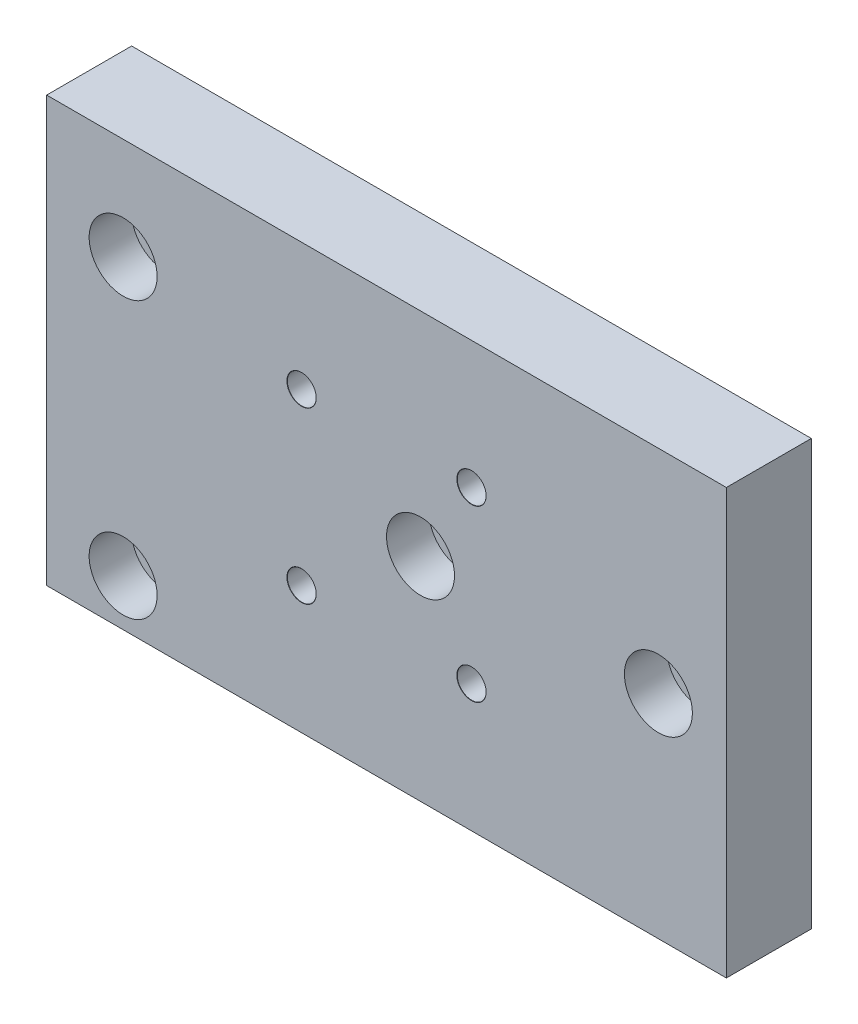
ISO-10303-21;
HEADER;
FILE_DESCRIPTION(('STEP AP214'),'2;1');
FILE_NAME('part.step','',(''),(''),'','','');
FILE_SCHEMA(('AUTOMOTIVE_DESIGN { 1 0 10303 214 1 1 1 1 }'));
ENDSEC;
DATA;
#1=APPLICATION_CONTEXT('core data for automotive mechanical design processes');
#2=APPLICATION_PROTOCOL_DEFINITION('international standard','automotive_design',2000,#1);
#3=PRODUCT_CONTEXT('',#1,'mechanical');
#4=PRODUCT('Part','Part','',(#3));
#5=PRODUCT_RELATED_PRODUCT_CATEGORY('part','',(#4));
#6=PRODUCT_DEFINITION_FORMATION('','',#4);
#7=PRODUCT_DEFINITION_CONTEXT('part definition',#1,'design');
#8=PRODUCT_DEFINITION('design','',#6,#7);
#9=PRODUCT_DEFINITION_SHAPE('','',#8);
#10=(LENGTH_UNIT() NAMED_UNIT(*) SI_UNIT(.MILLI.,.METRE.));
#11=(NAMED_UNIT(*) PLANE_ANGLE_UNIT() SI_UNIT($,.RADIAN.));
#12=(NAMED_UNIT(*) SI_UNIT($,.STERADIAN.) SOLID_ANGLE_UNIT());
#13=UNCERTAINTY_MEASURE_WITH_UNIT(LENGTH_MEASURE(1.E-05),#10,'distance_accuracy_value','');
#14=(GEOMETRIC_REPRESENTATION_CONTEXT(3) GLOBAL_UNCERTAINTY_ASSIGNED_CONTEXT((#13)) GLOBAL_UNIT_ASSIGNED_CONTEXT((#10,
#11,#12)) REPRESENTATION_CONTEXT('',''));
#15=CARTESIAN_POINT('',(0.,0.,0.));
#16=DIRECTION('',(0.,0.,1.));
#17=DIRECTION('',(1.,0.,0.));
#18=AXIS2_PLACEMENT_3D('',#15,#16,#17);
#19=CARTESIAN_POINT('',(-31.,-19.5,10.));
#20=DIRECTION('',(0.,0.,-1.));
#21=DIRECTION('',(-1.,0.,0.));
#22=AXIS2_PLACEMENT_3D('',#19,#20,#21);
#23=CYLINDRICAL_SURFACE('',#22,1.75);
#24=CARTESIAN_POINT('',(-31.,-19.5,0.));
#25=DIRECTION('',(0.,0.,-1.));
#26=DIRECTION('',(-1.,0.,0.));
#27=AXIS2_PLACEMENT_3D('',#24,#25,#26);
#28=CIRCLE('',#27,1.75);
#29=CARTESIAN_POINT('',(-32.75,-19.5,0.));
#30=VERTEX_POINT('',#29);
#31=EDGE_CURVE('E122',#30,#30,#28,.T.);
#32=ORIENTED_EDGE('',*,*,#31,.T.);
#33=EDGE_LOOP('',(#32));
#34=FACE_BOUND('',#33,.T.);
#35=CARTESIAN_POINT('',(-31.,-19.5,5.));
#36=DIRECTION('',(0.,0.,1.));
#37=DIRECTION('',(1.,0.,0.));
#38=AXIS2_PLACEMENT_3D('',#35,#36,#37);
#39=CIRCLE('',#38,1.75);
#40=CARTESIAN_POINT('',(-29.25,-19.5,5.));
#41=VERTEX_POINT('',#40);
#42=EDGE_CURVE('E39',#41,#41,#39,.F.);
#43=ORIENTED_EDGE('',*,*,#42,.F.);
#44=EDGE_LOOP('',(#43));
#45=FACE_BOUND('',#44,.T.);
#46=ADVANCED_FACE('F35',(#34,#45),#23,.F.);
#47=CARTESIAN_POINT('',(-31.,13.,10.));
#48=DIRECTION('',(0.,0.,-1.));
#49=DIRECTION('',(-1.,0.,0.));
#50=AXIS2_PLACEMENT_3D('',#47,#48,#49);
#51=CYLINDRICAL_SURFACE('',#50,1.75000000000001);
#52=CARTESIAN_POINT('',(-31.,13.,0.));
#53=DIRECTION('',(0.,0.,-1.));
#54=DIRECTION('',(-1.,0.,0.));
#55=AXIS2_PLACEMENT_3D('',#52,#53,#54);
#56=CIRCLE('',#55,1.75000000000001);
#57=CARTESIAN_POINT('',(-32.75,13.,0.));
#58=VERTEX_POINT('',#57);
#59=EDGE_CURVE('E126',#58,#58,#56,.T.);
#60=ORIENTED_EDGE('',*,*,#59,.T.);
#61=EDGE_LOOP('',(#60));
#62=FACE_BOUND('',#61,.T.);
#63=CARTESIAN_POINT('',(-31.,13.,5.));
#64=DIRECTION('',(0.,0.,1.));
#65=DIRECTION('',(1.,0.,0.));
#66=AXIS2_PLACEMENT_3D('',#63,#64,#65);
#67=CIRCLE('',#66,1.75000000000001);
#68=CARTESIAN_POINT('',(-29.25,13.,5.));
#69=VERTEX_POINT('',#68);
#70=EDGE_CURVE('E117',#69,#69,#67,.F.);
#71=ORIENTED_EDGE('',*,*,#70,.F.);
#72=EDGE_LOOP('',(#71));
#73=FACE_BOUND('',#72,.T.);
#74=ADVANCED_FACE('F238',(#62,#73),#51,.F.);
#75=CARTESIAN_POINT('',(4.,0.,10.));
#76=DIRECTION('',(0.,0.,-1.));
#77=DIRECTION('',(-1.,0.,0.));
#78=AXIS2_PLACEMENT_3D('',#75,#76,#77);
#79=CYLINDRICAL_SURFACE('',#78,1.75);
#80=CARTESIAN_POINT('',(4.,0.,0.));
#81=DIRECTION('',(0.,0.,-1.));
#82=DIRECTION('',(-1.,0.,0.));
#83=AXIS2_PLACEMENT_3D('',#80,#81,#82);
#84=CIRCLE('',#83,1.75);
#85=CARTESIAN_POINT('',(2.25,0.,0.));
#86=VERTEX_POINT('',#85);
#87=EDGE_CURVE('E131',#86,#86,#84,.T.);
#88=ORIENTED_EDGE('',*,*,#87,.T.);
#89=EDGE_LOOP('',(#88));
#90=FACE_BOUND('',#89,.T.);
#91=CARTESIAN_POINT('',(4.,0.,5.));
#92=DIRECTION('',(0.,0.,1.));
#93=DIRECTION('',(1.,0.,0.));
#94=AXIS2_PLACEMENT_3D('',#91,#92,#93);
#95=CIRCLE('',#94,1.75);
#96=CARTESIAN_POINT('',(5.75,0.,5.));
#97=VERTEX_POINT('',#96);
#98=EDGE_CURVE('E114',#97,#97,#95,.F.);
#99=ORIENTED_EDGE('',*,*,#98,.F.);
#100=EDGE_LOOP('',(#99));
#101=FACE_BOUND('',#100,.T.);
#102=ADVANCED_FACE('F243',(#90,#101),#79,.F.);
#103=CARTESIAN_POINT('',(32.,0.,10.));
#104=DIRECTION('',(0.,0.,-1.));
#105=DIRECTION('',(-1.,0.,0.));
#106=AXIS2_PLACEMENT_3D('',#103,#104,#105);
#107=CYLINDRICAL_SURFACE('',#106,1.75);
#108=CARTESIAN_POINT('',(32.,0.,0.));
#109=DIRECTION('',(0.,0.,-1.));
#110=DIRECTION('',(-1.,0.,0.));
#111=AXIS2_PLACEMENT_3D('',#108,#109,#110);
#112=CIRCLE('',#111,1.75);
#113=CARTESIAN_POINT('',(30.25,0.,0.));
#114=VERTEX_POINT('',#113);
#115=EDGE_CURVE('E105',#114,#114,#112,.T.);
#116=ORIENTED_EDGE('',*,*,#115,.T.);
#117=EDGE_LOOP('',(#116));
#118=FACE_BOUND('',#117,.T.);
#119=CARTESIAN_POINT('',(32.,0.,5.));
#120=DIRECTION('',(0.,0.,1.));
#121=DIRECTION('',(1.,0.,0.));
#122=AXIS2_PLACEMENT_3D('',#119,#120,#121);
#123=CIRCLE('',#122,1.75);
#124=CARTESIAN_POINT('',(33.75,0.,5.));
#125=VERTEX_POINT('',#124);
#126=EDGE_CURVE('E111',#125,#125,#123,.F.);
#127=ORIENTED_EDGE('',*,*,#126,.F.);
#128=EDGE_LOOP('',(#127));
#129=FACE_BOUND('',#128,.T.);
#130=ADVANCED_FACE('F260',(#118,#129),#107,.F.);
#131=CARTESIAN_POINT('',(40.,25.,10.));
#132=DIRECTION('',(-1.,0.,0.));
#133=DIRECTION('',(0.,0.,1.));
#134=AXIS2_PLACEMENT_3D('',#131,#132,#133);
#135=PLANE('',#134);
#136=DIRECTION('',(0.,1.,0.));
#137=VECTOR('',#136,1.);
#138=CARTESIAN_POINT('',(40.,25.,0.));
#139=LINE('',#138,#137);
#140=CARTESIAN_POINT('',(40.,-25.,0.));
#141=VERTEX_POINT('',#140);
#142=CARTESIAN_POINT('',(40.,25.,0.));
#143=VERTEX_POINT('',#142);
#144=EDGE_CURVE('E102',#141,#143,#139,.T.);
#145=ORIENTED_EDGE('',*,*,#144,.T.);
#146=DIRECTION('',(0.,0.,-1.));
#147=VECTOR('',#146,1.);
#148=CARTESIAN_POINT('',(40.,25.,10.));
#149=LINE('',#148,#147);
#150=CARTESIAN_POINT('',(40.,25.,10.));
#151=VERTEX_POINT('',#150);
#152=EDGE_CURVE('E11',#151,#143,#149,.T.);
#153=ORIENTED_EDGE('',*,*,#152,.F.);
#154=DIRECTION('',(0.,1.,0.));
#155=VECTOR('',#154,1.);
#156=CARTESIAN_POINT('',(40.,25.,10.));
#157=LINE('',#156,#155);
#158=CARTESIAN_POINT('',(40.,-25.,10.));
#159=VERTEX_POINT('',#158);
#160=EDGE_CURVE('E89',#159,#151,#157,.T.);
#161=ORIENTED_EDGE('',*,*,#160,.F.);
#162=DIRECTION('',(0.,0.,-1.));
#163=VECTOR('',#162,1.);
#164=CARTESIAN_POINT('',(40.,-25.,10.));
#165=LINE('',#164,#163);
#166=EDGE_CURVE('E98',#159,#141,#165,.T.);
#167=ORIENTED_EDGE('',*,*,#166,.T.);
#168=EDGE_LOOP('',(#145,#153,#161,#167));
#169=FACE_BOUND('',#168,.T.);
#170=ADVANCED_FACE('F37',(#169),#135,.F.);
#171=CARTESIAN_POINT('',(-40.,25.,10.));
#172=DIRECTION('',(0.,-1.,0.));
#173=DIRECTION('',(0.,0.,-1.));
#174=AXIS2_PLACEMENT_3D('',#171,#172,#173);
#175=PLANE('',#174);
#176=DIRECTION('',(-1.,0.,0.));
#177=VECTOR('',#176,1.);
#178=CARTESIAN_POINT('',(-40.,25.,0.));
#179=LINE('',#178,#177);
#180=CARTESIAN_POINT('',(-40.,25.,0.));
#181=VERTEX_POINT('',#180);
#182=EDGE_CURVE('E93',#143,#181,#179,.T.);
#183=ORIENTED_EDGE('',*,*,#182,.T.);
#184=DIRECTION('',(0.,0.,-1.));
#185=VECTOR('',#184,1.);
#186=CARTESIAN_POINT('',(-40.,25.,10.));
#187=LINE('',#186,#185);
#188=CARTESIAN_POINT('',(-40.,25.,10.));
#189=VERTEX_POINT('',#188);
#190=EDGE_CURVE('E45',#189,#181,#187,.T.);
#191=ORIENTED_EDGE('',*,*,#190,.F.);
#192=DIRECTION('',(-1.,0.,0.));
#193=VECTOR('',#192,1.);
#194=CARTESIAN_POINT('',(-40.,25.,10.));
#195=LINE('',#194,#193);
#196=EDGE_CURVE('E84',#151,#189,#195,.T.);
#197=ORIENTED_EDGE('',*,*,#196,.F.);
#198=ORIENTED_EDGE('',*,*,#152,.T.);
#199=EDGE_LOOP('',(#183,#191,#197,#198));
#200=FACE_BOUND('',#199,.T.);
#201=ADVANCED_FACE('F92',(#200),#175,.F.);
#202=CARTESIAN_POINT('',(-40.,25.,10.));
#203=DIRECTION('',(1.,0.,0.));
#204=DIRECTION('',(0.,1.,0.));
#205=AXIS2_PLACEMENT_3D('',#202,#203,#204);
#206=PLANE('',#205);
#207=DIRECTION('',(0.,-1.,0.));
#208=VECTOR('',#207,1.);
#209=CARTESIAN_POINT('',(-40.,25.,0.));
#210=LINE('',#209,#208);
#211=CARTESIAN_POINT('',(-40.,-25.,0.));
#212=VERTEX_POINT('',#211);
#213=EDGE_CURVE('E71',#181,#212,#210,.T.);
#214=ORIENTED_EDGE('',*,*,#213,.T.);
#215=DIRECTION('',(0.,0.,-1.));
#216=VECTOR('',#215,1.);
#217=CARTESIAN_POINT('',(-40.,-25.,10.));
#218=LINE('',#217,#216);
#219=CARTESIAN_POINT('',(-40.,-25.,10.));
#220=VERTEX_POINT('',#219);
#221=EDGE_CURVE('E94',#220,#212,#218,.T.);
#222=ORIENTED_EDGE('',*,*,#221,.F.);
#223=DIRECTION('',(0.,-1.,0.));
#224=VECTOR('',#223,1.);
#225=CARTESIAN_POINT('',(-40.,25.,10.));
#226=LINE('',#225,#224);
#227=EDGE_CURVE('E87',#189,#220,#226,.T.);
#228=ORIENTED_EDGE('',*,*,#227,.F.);
#229=ORIENTED_EDGE('',*,*,#190,.T.);
#230=EDGE_LOOP('',(#214,#222,#228,#229));
#231=FACE_BOUND('',#230,.T.);
#232=ADVANCED_FACE('F96',(#231),#206,.F.);
#233=CARTESIAN_POINT('',(-40.,-25.,10.));
#234=DIRECTION('',(0.,1.,0.));
#235=DIRECTION('',(0.,0.,1.));
#236=AXIS2_PLACEMENT_3D('',#233,#234,#235);
#237=PLANE('',#236);
#238=DIRECTION('',(1.,0.,0.));
#239=VECTOR('',#238,1.);
#240=CARTESIAN_POINT('',(-40.,-25.,0.));
#241=LINE('',#240,#239);
#242=EDGE_CURVE('E77',#212,#141,#241,.T.);
#243=ORIENTED_EDGE('',*,*,#242,.T.);
#244=ORIENTED_EDGE('',*,*,#166,.F.);
#245=DIRECTION('',(1.,0.,0.));
#246=VECTOR('',#245,1.);
#247=CARTESIAN_POINT('',(-40.,-25.,10.));
#248=LINE('',#247,#246);
#249=EDGE_CURVE('E54',#220,#159,#248,.T.);
#250=ORIENTED_EDGE('',*,*,#249,.F.);
#251=ORIENTED_EDGE('',*,*,#221,.T.);
#252=EDGE_LOOP('',(#243,#244,#250,#251));
#253=FACE_BOUND('',#252,.T.);
#254=ADVANCED_FACE('F203',(#253),#237,.F.);
#255=CARTESIAN_POINT('',(0.,0.,10.));
#256=DIRECTION('',(0.,0.,1.));
#257=DIRECTION('',(1.,0.,0.));
#258=AXIS2_PLACEMENT_3D('',#255,#256,#257);
#259=PLANE('',#258);
#260=CARTESIAN_POINT('',(-10.,10.,10.));
#261=DIRECTION('',(0.,0.,1.));
#262=DIRECTION('',(1.,0.,0.));
#263=AXIS2_PLACEMENT_3D('',#260,#261,#262);
#264=CIRCLE('',#263,1.725);
#265=CARTESIAN_POINT('',(-8.275,10.,10.));
#266=VERTEX_POINT('',#265);
#267=EDGE_CURVE('E194',#266,#266,#264,.T.);
#268=ORIENTED_EDGE('',*,*,#267,.F.);
#269=EDGE_LOOP('',(#268));
#270=FACE_BOUND('',#269,.T.);
#271=CARTESIAN_POINT('',(10.,10.,10.));
#272=DIRECTION('',(0.,0.,1.));
#273=DIRECTION('',(1.,0.,0.));
#274=AXIS2_PLACEMENT_3D('',#271,#272,#273);
#275=CIRCLE('',#274,1.725);
#276=CARTESIAN_POINT('',(11.725,10.,10.));
#277=VERTEX_POINT('',#276);
#278=EDGE_CURVE('E185',#277,#277,#275,.T.);
#279=ORIENTED_EDGE('',*,*,#278,.F.);
#280=EDGE_LOOP('',(#279));
#281=FACE_BOUND('',#280,.T.);
#282=CARTESIAN_POINT('',(10.,-10.,10.));
#283=DIRECTION('',(0.,0.,1.));
#284=DIRECTION('',(1.,0.,0.));
#285=AXIS2_PLACEMENT_3D('',#282,#283,#284);
#286=CIRCLE('',#285,1.725);
#287=CARTESIAN_POINT('',(11.725,-10.,10.));
#288=VERTEX_POINT('',#287);
#289=EDGE_CURVE('E176',#288,#288,#286,.T.);
#290=ORIENTED_EDGE('',*,*,#289,.F.);
#291=EDGE_LOOP('',(#290));
#292=FACE_BOUND('',#291,.T.);
#293=CARTESIAN_POINT('',(-10.,-10.,10.));
#294=DIRECTION('',(0.,0.,1.));
#295=DIRECTION('',(1.,0.,0.));
#296=AXIS2_PLACEMENT_3D('',#293,#294,#295);
#297=CIRCLE('',#296,1.725);
#298=CARTESIAN_POINT('',(-8.275,-10.,10.));
#299=VERTEX_POINT('',#298);
#300=EDGE_CURVE('E167',#299,#299,#297,.T.);
#301=ORIENTED_EDGE('',*,*,#300,.F.);
#302=EDGE_LOOP('',(#301));
#303=FACE_BOUND('',#302,.T.);
#304=CARTESIAN_POINT('',(-31.,13.,10.));
#305=DIRECTION('',(0.,0.,1.));
#306=DIRECTION('',(1.,0.,0.));
#307=AXIS2_PLACEMENT_3D('',#304,#305,#306);
#308=CIRCLE('',#307,4.);
#309=CARTESIAN_POINT('',(-27.,13.,10.));
#310=VERTEX_POINT('',#309);
#311=EDGE_CURVE('E157',#310,#310,#308,.T.);
#312=ORIENTED_EDGE('',*,*,#311,.F.);
#313=EDGE_LOOP('',(#312));
#314=FACE_BOUND('',#313,.T.);
#315=CARTESIAN_POINT('',(4.,0.,10.));
#316=DIRECTION('',(0.,0.,1.));
#317=DIRECTION('',(1.,0.,0.));
#318=AXIS2_PLACEMENT_3D('',#315,#316,#317);
#319=CIRCLE('',#318,4.);
#320=CARTESIAN_POINT('',(8.,0.,10.));
#321=VERTEX_POINT('',#320);
#322=EDGE_CURVE('E151',#321,#321,#319,.T.);
#323=ORIENTED_EDGE('',*,*,#322,.F.);
#324=EDGE_LOOP('',(#323));
#325=FACE_BOUND('',#324,.T.);
#326=CARTESIAN_POINT('',(32.,0.,10.));
#327=DIRECTION('',(0.,0.,1.));
#328=DIRECTION('',(1.,0.,0.));
#329=AXIS2_PLACEMENT_3D('',#326,#327,#328);
#330=CIRCLE('',#329,4.00000000000001);
#331=CARTESIAN_POINT('',(36.,0.,10.));
#332=VERTEX_POINT('',#331);
#333=EDGE_CURVE('E145',#332,#332,#330,.T.);
#334=ORIENTED_EDGE('',*,*,#333,.F.);
#335=EDGE_LOOP('',(#334));
#336=FACE_BOUND('',#335,.T.);
#337=CARTESIAN_POINT('',(-31.,-19.5,10.));
#338=DIRECTION('',(0.,0.,1.));
#339=DIRECTION('',(1.,0.,0.));
#340=AXIS2_PLACEMENT_3D('',#337,#338,#339);
#341=CIRCLE('',#340,4.);
#342=CARTESIAN_POINT('',(-27.,-19.5,10.));
#343=VERTEX_POINT('',#342);
#344=EDGE_CURVE('E138',#343,#343,#341,.T.);
#345=ORIENTED_EDGE('',*,*,#344,.F.);
#346=EDGE_LOOP('',(#345));
#347=FACE_BOUND('',#346,.T.);
#348=ORIENTED_EDGE('',*,*,#160,.T.);
#349=ORIENTED_EDGE('',*,*,#196,.T.);
#350=ORIENTED_EDGE('',*,*,#227,.T.);
#351=ORIENTED_EDGE('',*,*,#249,.T.);
#352=EDGE_LOOP('',(#348,#349,#350,#351));
#353=FACE_BOUND('',#352,.T.);
#354=ADVANCED_FACE('F85',(#270,#281,#292,#303,#314,#325,#336,#347,#353),#259,.T.);
#355=CARTESIAN_POINT('',(0.,0.,0.));
#356=DIRECTION('',(0.,0.,1.));
#357=DIRECTION('',(1.,0.,0.));
#358=AXIS2_PLACEMENT_3D('',#355,#356,#357);
#359=PLANE('',#358);
#360=CARTESIAN_POINT('',(-10.,10.,0.));
#361=DIRECTION('',(0.,0.,1.));
#362=DIRECTION('',(1.,0.,0.));
#363=AXIS2_PLACEMENT_3D('',#360,#361,#362);
#364=CIRCLE('',#363,1.7);
#365=CARTESIAN_POINT('',(-8.3,10.,0.));
#366=VERTEX_POINT('',#365);
#367=EDGE_CURVE('E188',#366,#366,#364,.T.);
#368=ORIENTED_EDGE('',*,*,#367,.T.);
#369=EDGE_LOOP('',(#368));
#370=FACE_BOUND('',#369,.T.);
#371=CARTESIAN_POINT('',(10.,10.,0.));
#372=DIRECTION('',(0.,0.,1.));
#373=DIRECTION('',(1.,0.,0.));
#374=AXIS2_PLACEMENT_3D('',#371,#372,#373);
#375=CIRCLE('',#374,1.7);
#376=CARTESIAN_POINT('',(11.7,10.,0.));
#377=VERTEX_POINT('',#376);
#378=EDGE_CURVE('E179',#377,#377,#375,.T.);
#379=ORIENTED_EDGE('',*,*,#378,.T.);
#380=EDGE_LOOP('',(#379));
#381=FACE_BOUND('',#380,.T.);
#382=CARTESIAN_POINT('',(10.,-10.,0.));
#383=DIRECTION('',(0.,0.,1.));
#384=DIRECTION('',(1.,0.,0.));
#385=AXIS2_PLACEMENT_3D('',#382,#383,#384);
#386=CIRCLE('',#385,1.7);
#387=CARTESIAN_POINT('',(11.7,-10.,0.));
#388=VERTEX_POINT('',#387);
#389=EDGE_CURVE('E170',#388,#388,#386,.T.);
#390=ORIENTED_EDGE('',*,*,#389,.T.);
#391=EDGE_LOOP('',(#390));
#392=FACE_BOUND('',#391,.T.);
#393=CARTESIAN_POINT('',(-10.,-10.,0.));
#394=DIRECTION('',(0.,0.,1.));
#395=DIRECTION('',(1.,0.,0.));
#396=AXIS2_PLACEMENT_3D('',#393,#394,#395);
#397=CIRCLE('',#396,1.7);
#398=CARTESIAN_POINT('',(-8.3,-10.,0.));
#399=VERTEX_POINT('',#398);
#400=EDGE_CURVE('E142',#399,#399,#397,.T.);
#401=ORIENTED_EDGE('',*,*,#400,.T.);
#402=EDGE_LOOP('',(#401));
#403=FACE_BOUND('',#402,.T.);
#404=ORIENTED_EDGE('',*,*,#115,.F.);
#405=EDGE_LOOP('',(#404));
#406=FACE_BOUND('',#405,.T.);
#407=ORIENTED_EDGE('',*,*,#87,.F.);
#408=EDGE_LOOP('',(#407));
#409=FACE_BOUND('',#408,.T.);
#410=ORIENTED_EDGE('',*,*,#59,.F.);
#411=EDGE_LOOP('',(#410));
#412=FACE_BOUND('',#411,.T.);
#413=ORIENTED_EDGE('',*,*,#31,.F.);
#414=EDGE_LOOP('',(#413));
#415=FACE_BOUND('',#414,.T.);
#416=ORIENTED_EDGE('',*,*,#144,.F.);
#417=ORIENTED_EDGE('',*,*,#242,.F.);
#418=ORIENTED_EDGE('',*,*,#213,.F.);
#419=ORIENTED_EDGE('',*,*,#182,.F.);
#420=EDGE_LOOP('',(#416,#417,#418,#419));
#421=FACE_BOUND('',#420,.T.);
#422=ADVANCED_FACE('F202',(#370,#381,#392,#403,#406,#409,#412,#415,#421),#359,.F.);
#423=CARTESIAN_POINT('',(32.,0.,5.));
#424=DIRECTION('',(0.,0.,1.));
#425=DIRECTION('',(1.,0.,0.));
#426=AXIS2_PLACEMENT_3D('',#423,#424,#425);
#427=PLANE('',#426);
#428=CARTESIAN_POINT('',(32.,0.,5.));
#429=DIRECTION('',(0.,0.,1.));
#430=DIRECTION('',(1.,0.,0.));
#431=AXIS2_PLACEMENT_3D('',#428,#429,#430);
#432=CIRCLE('',#431,4.00000000000001);
#433=CARTESIAN_POINT('',(36.,0.,5.));
#434=VERTEX_POINT('',#433);
#435=EDGE_CURVE('E148',#434,#434,#432,.T.);
#436=ORIENTED_EDGE('',*,*,#435,.T.);
#437=EDGE_LOOP('',(#436));
#438=FACE_BOUND('',#437,.T.);
#439=ORIENTED_EDGE('',*,*,#126,.T.);
#440=EDGE_LOOP('',(#439));
#441=FACE_BOUND('',#440,.T.);
#442=ADVANCED_FACE('F251',(#438,#441),#427,.T.);
#443=CARTESIAN_POINT('',(32.,0.,5.));
#444=DIRECTION('',(0.,0.,1.));
#445=DIRECTION('',(1.,0.,0.));
#446=AXIS2_PLACEMENT_3D('',#443,#444,#445);
#447=CYLINDRICAL_SURFACE('',#446,4.00000000000001);
#448=ORIENTED_EDGE('',*,*,#435,.F.);
#449=EDGE_LOOP('',(#448));
#450=FACE_BOUND('',#449,.T.);
#451=ORIENTED_EDGE('',*,*,#333,.T.);
#452=EDGE_LOOP('',(#451));
#453=FACE_BOUND('',#452,.T.);
#454=ADVANCED_FACE('F277',(#450,#453),#447,.F.);
#455=CARTESIAN_POINT('',(4.,0.,5.));
#456=DIRECTION('',(0.,0.,1.));
#457=DIRECTION('',(1.,0.,0.));
#458=AXIS2_PLACEMENT_3D('',#455,#456,#457);
#459=PLANE('',#458);
#460=CARTESIAN_POINT('',(4.,0.,5.));
#461=DIRECTION('',(0.,0.,1.));
#462=DIRECTION('',(1.,0.,0.));
#463=AXIS2_PLACEMENT_3D('',#460,#461,#462);
#464=CIRCLE('',#463,4.);
#465=CARTESIAN_POINT('',(8.,0.,5.));
#466=VERTEX_POINT('',#465);
#467=EDGE_CURVE('E154',#466,#466,#464,.T.);
#468=ORIENTED_EDGE('',*,*,#467,.T.);
#469=EDGE_LOOP('',(#468));
#470=FACE_BOUND('',#469,.T.);
#471=ORIENTED_EDGE('',*,*,#98,.T.);
#472=EDGE_LOOP('',(#471));
#473=FACE_BOUND('',#472,.T.);
#474=ADVANCED_FACE('F284',(#470,#473),#459,.T.);
#475=CARTESIAN_POINT('',(4.,0.,5.));
#476=DIRECTION('',(0.,0.,1.));
#477=DIRECTION('',(1.,0.,0.));
#478=AXIS2_PLACEMENT_3D('',#475,#476,#477);
#479=CYLINDRICAL_SURFACE('',#478,4.);
#480=ORIENTED_EDGE('',*,*,#467,.F.);
#481=EDGE_LOOP('',(#480));
#482=FACE_BOUND('',#481,.T.);
#483=ORIENTED_EDGE('',*,*,#322,.T.);
#484=EDGE_LOOP('',(#483));
#485=FACE_BOUND('',#484,.T.);
#486=ADVANCED_FACE('F288',(#482,#485),#479,.F.);
#487=CARTESIAN_POINT('',(-31.,13.,5.));
#488=DIRECTION('',(0.,0.,1.));
#489=DIRECTION('',(1.,0.,0.));
#490=AXIS2_PLACEMENT_3D('',#487,#488,#489);
#491=PLANE('',#490);
#492=CARTESIAN_POINT('',(-31.,13.,5.));
#493=DIRECTION('',(0.,0.,1.));
#494=DIRECTION('',(1.,0.,0.));
#495=AXIS2_PLACEMENT_3D('',#492,#493,#494);
#496=CIRCLE('',#495,4.);
#497=CARTESIAN_POINT('',(-27.,13.,5.));
#498=VERTEX_POINT('',#497);
#499=EDGE_CURVE('E115',#498,#498,#496,.T.);
#500=ORIENTED_EDGE('',*,*,#499,.T.);
#501=EDGE_LOOP('',(#500));
#502=FACE_BOUND('',#501,.T.);
#503=ORIENTED_EDGE('',*,*,#70,.T.);
#504=EDGE_LOOP('',(#503));
#505=FACE_BOUND('',#504,.T.);
#506=ADVANCED_FACE('F291',(#502,#505),#491,.T.);
#507=CARTESIAN_POINT('',(-31.,13.,5.));
#508=DIRECTION('',(0.,0.,1.));
#509=DIRECTION('',(1.,0.,0.));
#510=AXIS2_PLACEMENT_3D('',#507,#508,#509);
#511=CYLINDRICAL_SURFACE('',#510,4.);
#512=ORIENTED_EDGE('',*,*,#499,.F.);
#513=EDGE_LOOP('',(#512));
#514=FACE_BOUND('',#513,.T.);
#515=ORIENTED_EDGE('',*,*,#311,.T.);
#516=EDGE_LOOP('',(#515));
#517=FACE_BOUND('',#516,.T.);
#518=ADVANCED_FACE('F232',(#514,#517),#511,.F.);
#519=CARTESIAN_POINT('',(-31.,-19.5,5.));
#520=DIRECTION('',(0.,0.,1.));
#521=DIRECTION('',(1.,0.,0.));
#522=AXIS2_PLACEMENT_3D('',#519,#520,#521);
#523=PLANE('',#522);
#524=CARTESIAN_POINT('',(-31.,-19.5,5.));
#525=DIRECTION('',(0.,0.,1.));
#526=DIRECTION('',(1.,0.,0.));
#527=AXIS2_PLACEMENT_3D('',#524,#525,#526);
#528=CIRCLE('',#527,4.);
#529=CARTESIAN_POINT('',(-27.,-19.5,5.));
#530=VERTEX_POINT('',#529);
#531=EDGE_CURVE('E141',#530,#530,#528,.T.);
#532=ORIENTED_EDGE('',*,*,#531,.T.);
#533=EDGE_LOOP('',(#532));
#534=FACE_BOUND('',#533,.T.);
#535=ORIENTED_EDGE('',*,*,#42,.T.);
#536=EDGE_LOOP('',(#535));
#537=FACE_BOUND('',#536,.T.);
#538=ADVANCED_FACE('F222',(#534,#537),#523,.T.);
#539=CARTESIAN_POINT('',(-31.,-19.5,5.));
#540=DIRECTION('',(0.,0.,1.));
#541=DIRECTION('',(1.,0.,0.));
#542=AXIS2_PLACEMENT_3D('',#539,#540,#541);
#543=CYLINDRICAL_SURFACE('',#542,4.);
#544=ORIENTED_EDGE('',*,*,#531,.F.);
#545=EDGE_LOOP('',(#544));
#546=FACE_BOUND('',#545,.T.);
#547=ORIENTED_EDGE('',*,*,#344,.T.);
#548=EDGE_LOOP('',(#547));
#549=FACE_BOUND('',#548,.T.);
#550=ADVANCED_FACE('F219',(#546,#549),#543,.F.);
#551=CARTESIAN_POINT('',(-10.,-10.,10.));
#552=DIRECTION('',(0.,0.,1.));
#553=DIRECTION('',(1.,0.,0.));
#554=AXIS2_PLACEMENT_3D('',#551,#552,#553);
#555=CYLINDRICAL_SURFACE('',#554,1.69999999999999);
#556=ORIENTED_EDGE('',*,*,#400,.F.);
#557=EDGE_LOOP('',(#556));
#558=FACE_BOUND('',#557,.T.);
#559=CARTESIAN_POINT('',(-10.,-10.,9.97499999999997));
#560=DIRECTION('',(0.,0.,1.));
#561=DIRECTION('',(1.,0.,0.));
#562=AXIS2_PLACEMENT_3D('',#559,#560,#561);
#563=CIRCLE('',#562,1.69999999999999);
#564=CARTESIAN_POINT('',(-8.30000000000001,-10.,9.97499999999997));
#565=VERTEX_POINT('',#564);
#566=EDGE_CURVE('E164',#565,#565,#563,.T.);
#567=ORIENTED_EDGE('',*,*,#566,.T.);
#568=EDGE_LOOP('',(#567));
#569=FACE_BOUND('',#568,.T.);
#570=ADVANCED_FACE('F221',(#558,#569),#555,.F.);
#571=CARTESIAN_POINT('',(-10.,-10.,10.));
#572=DIRECTION('',(0.,0.,1.));
#573=DIRECTION('',(1.,0.,0.));
#574=AXIS2_PLACEMENT_3D('',#571,#572,#573);
#575=CONICAL_SURFACE('',#574,1.725,0.785398163397171);
#576=ORIENTED_EDGE('',*,*,#566,.F.);
#577=EDGE_LOOP('',(#576));
#578=FACE_BOUND('',#577,.T.);
#579=ORIENTED_EDGE('',*,*,#300,.T.);
#580=EDGE_LOOP('',(#579));
#581=FACE_BOUND('',#580,.T.);
#582=ADVANCED_FACE('F229',(#578,#581),#575,.F.);
#583=CARTESIAN_POINT('',(10.,-10.,10.));
#584=DIRECTION('',(0.,0.,1.));
#585=DIRECTION('',(1.,0.,0.));
#586=AXIS2_PLACEMENT_3D('',#583,#584,#585);
#587=CYLINDRICAL_SURFACE('',#586,1.69999999999999);
#588=ORIENTED_EDGE('',*,*,#389,.F.);
#589=EDGE_LOOP('',(#588));
#590=FACE_BOUND('',#589,.T.);
#591=CARTESIAN_POINT('',(10.,-10.,9.97499999999997));
#592=DIRECTION('',(0.,0.,1.));
#593=DIRECTION('',(1.,0.,0.));
#594=AXIS2_PLACEMENT_3D('',#591,#592,#593);
#595=CIRCLE('',#594,1.69999999999999);
#596=CARTESIAN_POINT('',(11.7,-10.,9.97499999999997));
#597=VERTEX_POINT('',#596);
#598=EDGE_CURVE('E173',#597,#597,#595,.T.);
#599=ORIENTED_EDGE('',*,*,#598,.T.);
#600=EDGE_LOOP('',(#599));
#601=FACE_BOUND('',#600,.T.);
#602=ADVANCED_FACE('F304',(#590,#601),#587,.F.);
#603=CARTESIAN_POINT('',(10.,-10.,10.));
#604=DIRECTION('',(0.,0.,1.));
#605=DIRECTION('',(1.,0.,0.));
#606=AXIS2_PLACEMENT_3D('',#603,#604,#605);
#607=CONICAL_SURFACE('',#606,1.725,0.785398163397171);
#608=ORIENTED_EDGE('',*,*,#598,.F.);
#609=EDGE_LOOP('',(#608));
#610=FACE_BOUND('',#609,.T.);
#611=ORIENTED_EDGE('',*,*,#289,.T.);
#612=EDGE_LOOP('',(#611));
#613=FACE_BOUND('',#612,.T.);
#614=ADVANCED_FACE('F308',(#610,#613),#607,.F.);
#615=CARTESIAN_POINT('',(10.,10.,10.));
#616=DIRECTION('',(0.,0.,1.));
#617=DIRECTION('',(1.,0.,0.));
#618=AXIS2_PLACEMENT_3D('',#615,#616,#617);
#619=CYLINDRICAL_SURFACE('',#618,1.69999999999999);
#620=ORIENTED_EDGE('',*,*,#378,.F.);
#621=EDGE_LOOP('',(#620));
#622=FACE_BOUND('',#621,.T.);
#623=CARTESIAN_POINT('',(10.,10.,9.97499999999997));
#624=DIRECTION('',(0.,0.,1.));
#625=DIRECTION('',(1.,0.,0.));
#626=AXIS2_PLACEMENT_3D('',#623,#624,#625);
#627=CIRCLE('',#626,1.69999999999999);
#628=CARTESIAN_POINT('',(11.7,10.,9.97499999999997));
#629=VERTEX_POINT('',#628);
#630=EDGE_CURVE('E182',#629,#629,#627,.T.);
#631=ORIENTED_EDGE('',*,*,#630,.T.);
#632=EDGE_LOOP('',(#631));
#633=FACE_BOUND('',#632,.T.);
#634=ADVANCED_FACE('F312',(#622,#633),#619,.F.);
#635=CARTESIAN_POINT('',(10.,10.,10.));
#636=DIRECTION('',(0.,0.,1.));
#637=DIRECTION('',(1.,0.,0.));
#638=AXIS2_PLACEMENT_3D('',#635,#636,#637);
#639=CONICAL_SURFACE('',#638,1.725,0.785398163397171);
#640=ORIENTED_EDGE('',*,*,#630,.F.);
#641=EDGE_LOOP('',(#640));
#642=FACE_BOUND('',#641,.T.);
#643=ORIENTED_EDGE('',*,*,#278,.T.);
#644=EDGE_LOOP('',(#643));
#645=FACE_BOUND('',#644,.T.);
#646=ADVANCED_FACE('F316',(#642,#645),#639,.F.);
#647=CARTESIAN_POINT('',(-10.,10.,10.));
#648=DIRECTION('',(0.,0.,1.));
#649=DIRECTION('',(1.,0.,0.));
#650=AXIS2_PLACEMENT_3D('',#647,#648,#649);
#651=CYLINDRICAL_SURFACE('',#650,1.69999999999999);
#652=ORIENTED_EDGE('',*,*,#367,.F.);
#653=EDGE_LOOP('',(#652));
#654=FACE_BOUND('',#653,.T.);
#655=CARTESIAN_POINT('',(-10.,10.,9.97499999999997));
#656=DIRECTION('',(0.,0.,1.));
#657=DIRECTION('',(1.,0.,0.));
#658=AXIS2_PLACEMENT_3D('',#655,#656,#657);
#659=CIRCLE('',#658,1.69999999999999);
#660=CARTESIAN_POINT('',(-8.30000000000001,10.,9.97499999999997));
#661=VERTEX_POINT('',#660);
#662=EDGE_CURVE('E191',#661,#661,#659,.T.);
#663=ORIENTED_EDGE('',*,*,#662,.T.);
#664=EDGE_LOOP('',(#663));
#665=FACE_BOUND('',#664,.T.);
#666=ADVANCED_FACE('F320',(#654,#665),#651,.F.);
#667=CARTESIAN_POINT('',(-10.,10.,10.));
#668=DIRECTION('',(0.,0.,1.));
#669=DIRECTION('',(1.,0.,0.));
#670=AXIS2_PLACEMENT_3D('',#667,#668,#669);
#671=CONICAL_SURFACE('',#670,1.725,0.785398163397171);
#672=ORIENTED_EDGE('',*,*,#662,.F.);
#673=EDGE_LOOP('',(#672));
#674=FACE_BOUND('',#673,.T.);
#675=ORIENTED_EDGE('',*,*,#267,.T.);
#676=EDGE_LOOP('',(#675));
#677=FACE_BOUND('',#676,.T.);
#678=ADVANCED_FACE('F198',(#674,#677),#671,.F.);
#679=CLOSED_SHELL('',(#46,#74,#102,#130,#170,#201,#232,#254,#354,#422,#442,#454,#474,#486,#506,
#518,#538,#550,#570,#582,#602,#614,#634,#646,#666,#678));
#680=MANIFOLD_SOLID_BREP('B2',#679);
#681=ADVANCED_BREP_SHAPE_REPRESENTATION('',(#18,#680),#14);
#682=SHAPE_DEFINITION_REPRESENTATION(#9,#681);
ENDSEC;
END-ISO-10303-21;
